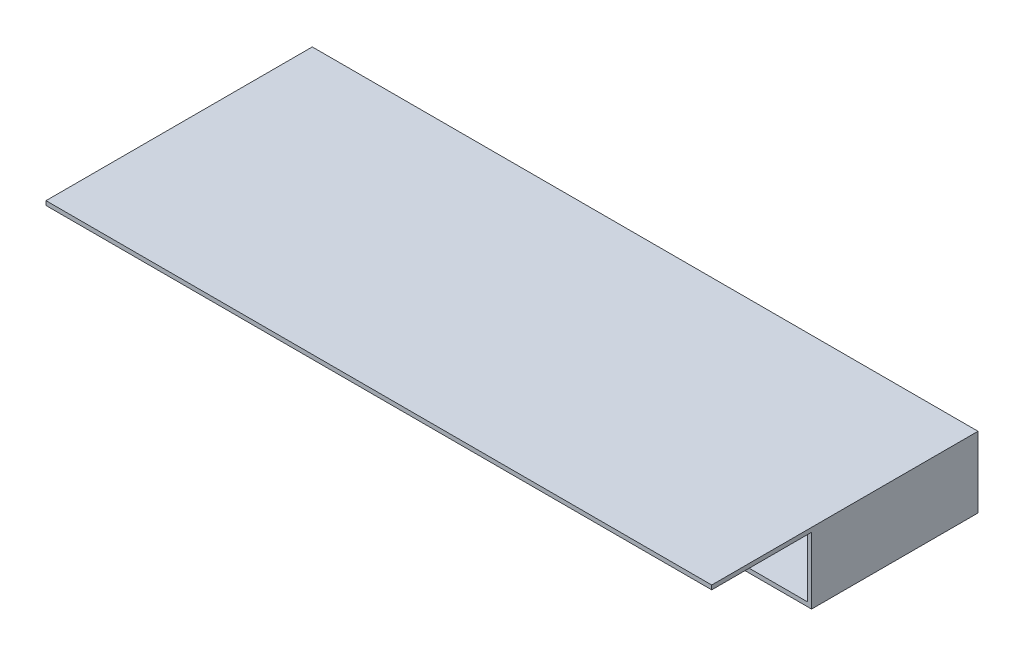
ISO-10303-21;
HEADER;
FILE_DESCRIPTION(('STEP AP214'),'2;1');
FILE_NAME('part.step','',(''),(''),'','','');
FILE_SCHEMA(('AUTOMOTIVE_DESIGN { 1 0 10303 214 1 1 1 1 }'));
ENDSEC;
DATA;
#1=APPLICATION_CONTEXT('core data for automotive mechanical design processes');
#2=APPLICATION_PROTOCOL_DEFINITION('international standard','automotive_design',2000,#1);
#3=PRODUCT_CONTEXT('',#1,'mechanical');
#4=PRODUCT('Part','Part','',(#3));
#5=PRODUCT_RELATED_PRODUCT_CATEGORY('part','',(#4));
#6=PRODUCT_DEFINITION_FORMATION('','',#4);
#7=PRODUCT_DEFINITION_CONTEXT('part definition',#1,'design');
#8=PRODUCT_DEFINITION('design','',#6,#7);
#9=PRODUCT_DEFINITION_SHAPE('','',#8);
#10=(LENGTH_UNIT() NAMED_UNIT(*) SI_UNIT(.MILLI.,.METRE.));
#11=(NAMED_UNIT(*) PLANE_ANGLE_UNIT() SI_UNIT($,.RADIAN.));
#12=(NAMED_UNIT(*) SI_UNIT($,.STERADIAN.) SOLID_ANGLE_UNIT());
#13=UNCERTAINTY_MEASURE_WITH_UNIT(LENGTH_MEASURE(1.E-05),#10,'distance_accuracy_value','');
#14=(GEOMETRIC_REPRESENTATION_CONTEXT(3) GLOBAL_UNCERTAINTY_ASSIGNED_CONTEXT((#13)) GLOBAL_UNIT_ASSIGNED_CONTEXT((#10,
#11,#12)) REPRESENTATION_CONTEXT('',''));
#15=CARTESIAN_POINT('',(0.,0.,0.));
#16=DIRECTION('',(0.,0.,1.));
#17=DIRECTION('',(1.,0.,0.));
#18=AXIS2_PLACEMENT_3D('',#15,#16,#17);
#19=CARTESIAN_POINT('',(0.,0.,0.));
#20=DIRECTION('',(0.,-1.,0.));
#21=DIRECTION('',(0.,0.,-1.));
#22=AXIS2_PLACEMENT_3D('',#19,#20,#21);
#23=PLANE('',#22);
#24=DIRECTION('',(1.,0.,0.));
#25=VECTOR('',#24,1.);
#26=CARTESIAN_POINT('',(12.7,0.,100.));
#27=LINE('',#26,#25);
#28=CARTESIAN_POINT('',(-12.7,0.,100.));
#29=VERTEX_POINT('',#28);
#30=CARTESIAN_POINT('',(12.7,0.,100.));
#31=VERTEX_POINT('',#30);
#32=EDGE_CURVE('E153',#29,#31,#27,.T.);
#33=ORIENTED_EDGE('',*,*,#32,.T.);
#34=DIRECTION('',(0.,0.,-1.));
#35=VECTOR('',#34,1.);
#36=CARTESIAN_POINT('',(12.7,0.,289.014417439517));
#37=LINE('',#36,#35);
#38=CARTESIAN_POINT('',(12.7,0.,-387.3));
#39=VERTEX_POINT('',#38);
#40=EDGE_CURVE('E384',#31,#39,#37,.T.);
#41=ORIENTED_EDGE('',*,*,#40,.T.);
#42=DIRECTION('',(-1.,0.,0.));
#43=VECTOR('',#42,1.);
#44=CARTESIAN_POINT('',(0.,0.,-387.3));
#45=LINE('',#44,#43);
#46=CARTESIAN_POINT('',(987.3,0.,-387.3));
#47=VERTEX_POINT('',#46);
#48=EDGE_CURVE('E170',#47,#39,#45,.T.);
#49=ORIENTED_EDGE('',*,*,#48,.F.);
#50=DIRECTION('',(0.,0.,-1.));
#51=VECTOR('',#50,1.);
#52=CARTESIAN_POINT('',(987.3,0.,0.));
#53=LINE('',#52,#51);
#54=CARTESIAN_POINT('',(987.3,0.,100.));
#55=VERTEX_POINT('',#54);
#56=EDGE_CURVE('E166',#55,#47,#53,.T.);
#57=ORIENTED_EDGE('',*,*,#56,.F.);
#58=DIRECTION('',(-1.,0.,0.));
#59=VECTOR('',#58,1.);
#60=CARTESIAN_POINT('',(-1000.,0.,100.));
#61=LINE('',#60,#59);
#62=CARTESIAN_POINT('',(1000.,0.,100.));
#63=VERTEX_POINT('',#62);
#64=EDGE_CURVE('E189',#63,#55,#61,.T.);
#65=ORIENTED_EDGE('',*,*,#64,.F.);
#66=DIRECTION('',(0.,0.,-1.));
#67=VECTOR('',#66,1.);
#68=CARTESIAN_POINT('',(1000.,0.,400.));
#69=LINE('',#68,#67);
#70=CARTESIAN_POINT('',(1000.,0.,400.));
#71=VERTEX_POINT('',#70);
#72=EDGE_CURVE('E210',#71,#63,#69,.T.);
#73=ORIENTED_EDGE('',*,*,#72,.F.);
#74=DIRECTION('',(-1.,0.,0.));
#75=VECTOR('',#74,1.);
#76=CARTESIAN_POINT('',(1000.,0.,400.));
#77=LINE('',#76,#75);
#78=CARTESIAN_POINT('',(-1000.,0.,400.));
#79=VERTEX_POINT('',#78);
#80=EDGE_CURVE('E205',#71,#79,#77,.T.);
#81=ORIENTED_EDGE('',*,*,#80,.T.);
#82=DIRECTION('',(0.,0.,-1.));
#83=VECTOR('',#82,1.);
#84=CARTESIAN_POINT('',(-1000.,0.,400.));
#85=LINE('',#84,#83);
#86=CARTESIAN_POINT('',(-1000.,0.,100.));
#87=VERTEX_POINT('',#86);
#88=EDGE_CURVE('E219',#79,#87,#85,.T.);
#89=ORIENTED_EDGE('',*,*,#88,.T.);
#90=CARTESIAN_POINT('',(-987.3,0.,100.));
#91=VERTEX_POINT('',#90);
#92=EDGE_CURVE('E199',#91,#87,#61,.T.);
#93=ORIENTED_EDGE('',*,*,#92,.F.);
#94=DIRECTION('',(0.,0.,-1.));
#95=VECTOR('',#94,1.);
#96=CARTESIAN_POINT('',(-987.3,0.,0.));
#97=LINE('',#96,#95);
#98=CARTESIAN_POINT('',(-987.3,0.,-387.3));
#99=VERTEX_POINT('',#98);
#100=EDGE_CURVE('E174',#91,#99,#97,.T.);
#101=ORIENTED_EDGE('',*,*,#100,.T.);
#102=CARTESIAN_POINT('',(-12.7,0.,-387.3));
#103=VERTEX_POINT('',#102);
#104=EDGE_CURVE('E173',#103,#99,#45,.T.);
#105=ORIENTED_EDGE('',*,*,#104,.F.);
#106=DIRECTION('',(0.,0.,-1.));
#107=VECTOR('',#106,1.);
#108=CARTESIAN_POINT('',(-12.7,0.,289.014417439517));
#109=LINE('',#108,#107);
#110=EDGE_CURVE('E139',#29,#103,#109,.T.);
#111=ORIENTED_EDGE('',*,*,#110,.F.);
#112=EDGE_LOOP('',(#33,#41,#49,#57,#65,#73,#81,#89,#93,#101,#105,#111));
#113=FACE_BOUND('',#112,.T.);
#114=ADVANCED_FACE('F33',(#113),#23,.T.);
#115=CARTESIAN_POINT('',(1000.,12.7,-387.3));
#116=DIRECTION('',(0.,0.,1.));
#117=DIRECTION('',(1.,0.,0.));
#118=AXIS2_PLACEMENT_3D('',#115,#116,#117);
#119=PLANE('',#118);
#120=ORIENTED_EDGE('',*,*,#48,.T.);
#121=DIRECTION('',(0.,1.,0.));
#122=VECTOR('',#121,1.);
#123=CARTESIAN_POINT('',(12.7,-187.3,-387.3));
#124=LINE('',#123,#122);
#125=CARTESIAN_POINT('',(12.7,-187.3,-387.3));
#126=VERTEX_POINT('',#125);
#127=EDGE_CURVE('E143',#126,#39,#124,.T.);
#128=ORIENTED_EDGE('',*,*,#127,.F.);
#129=DIRECTION('',(1.,0.,0.));
#130=VECTOR('',#129,1.);
#131=CARTESIAN_POINT('',(0.,-187.3,-387.3));
#132=LINE('',#131,#130);
#133=CARTESIAN_POINT('',(987.3,-187.3,-387.3));
#134=VERTEX_POINT('',#133);
#135=EDGE_CURVE('E160',#126,#134,#132,.T.);
#136=ORIENTED_EDGE('',*,*,#135,.T.);
#137=DIRECTION('',(0.,-1.,0.));
#138=VECTOR('',#137,1.);
#139=CARTESIAN_POINT('',(987.3,12.7,-387.3));
#140=LINE('',#139,#138);
#141=EDGE_CURVE('E169',#47,#134,#140,.T.);
#142=ORIENTED_EDGE('',*,*,#141,.F.);
#143=EDGE_LOOP('',(#120,#128,#136,#142));
#144=FACE_BOUND('',#143,.T.);
#145=ADVANCED_FACE('F267',(#144),#119,.T.);
#146=CARTESIAN_POINT('',(-987.3,-187.3,-387.3));
#147=VERTEX_POINT('',#146);
#148=CARTESIAN_POINT('',(-12.7,-187.3,-387.3));
#149=VERTEX_POINT('',#148);
#150=EDGE_CURVE('E150',#147,#149,#132,.T.);
#151=ORIENTED_EDGE('',*,*,#150,.T.);
#152=DIRECTION('',(0.,-1.,0.));
#153=VECTOR('',#152,1.);
#154=CARTESIAN_POINT('',(-12.7,-187.3,-387.3));
#155=LINE('',#154,#153);
#156=EDGE_CURVE('E136',#103,#149,#155,.T.);
#157=ORIENTED_EDGE('',*,*,#156,.F.);
#158=ORIENTED_EDGE('',*,*,#104,.T.);
#159=DIRECTION('',(0.,-1.,0.));
#160=VECTOR('',#159,1.);
#161=CARTESIAN_POINT('',(-987.3,12.7,-387.3));
#162=LINE('',#161,#160);
#163=EDGE_CURVE('E158',#99,#147,#162,.T.);
#164=ORIENTED_EDGE('',*,*,#163,.T.);
#165=EDGE_LOOP('',(#151,#157,#158,#164));
#166=FACE_BOUND('',#165,.T.);
#167=ADVANCED_FACE('F156',(#166),#119,.T.);
#168=CARTESIAN_POINT('',(0.,-187.3,0.));
#169=DIRECTION('',(0.,1.,0.));
#170=DIRECTION('',(0.,0.,1.));
#171=AXIS2_PLACEMENT_3D('',#168,#169,#170);
#172=PLANE('',#171);
#173=ORIENTED_EDGE('',*,*,#135,.F.);
#174=DIRECTION('',(0.,0.,-1.));
#175=VECTOR('',#174,1.);
#176=CARTESIAN_POINT('',(12.7,-187.3,289.014417439517));
#177=LINE('',#176,#175);
#178=CARTESIAN_POINT('',(12.7,-187.3,100.));
#179=VERTEX_POINT('',#178);
#180=EDGE_CURVE('E154',#179,#126,#177,.T.);
#181=ORIENTED_EDGE('',*,*,#180,.F.);
#182=DIRECTION('',(-1.,0.,0.));
#183=VECTOR('',#182,1.);
#184=CARTESIAN_POINT('',(0.,-187.3,100.));
#185=LINE('',#184,#183);
#186=CARTESIAN_POINT('',(987.3,-187.3,100.));
#187=VERTEX_POINT('',#186);
#188=EDGE_CURVE('E58',#187,#179,#185,.T.);
#189=ORIENTED_EDGE('',*,*,#188,.F.);
#190=DIRECTION('',(0.,0.,1.));
#191=VECTOR('',#190,1.);
#192=CARTESIAN_POINT('',(987.3,-187.3,0.));
#193=LINE('',#192,#191);
#194=EDGE_CURVE('E159',#134,#187,#193,.T.);
#195=ORIENTED_EDGE('',*,*,#194,.F.);
#196=EDGE_LOOP('',(#173,#181,#189,#195));
#197=FACE_BOUND('',#196,.T.);
#198=ADVANCED_FACE('F343',(#197),#172,.T.);
#199=CARTESIAN_POINT('',(-12.7,-187.3,100.));
#200=VERTEX_POINT('',#199);
#201=CARTESIAN_POINT('',(-987.3,-187.3,100.));
#202=VERTEX_POINT('',#201);
#203=EDGE_CURVE('E152',#200,#202,#185,.T.);
#204=ORIENTED_EDGE('',*,*,#203,.F.);
#205=DIRECTION('',(0.,0.,-1.));
#206=VECTOR('',#205,1.);
#207=CARTESIAN_POINT('',(-12.7,-187.3,289.014417439517));
#208=LINE('',#207,#206);
#209=EDGE_CURVE('E50',#200,#149,#208,.T.);
#210=ORIENTED_EDGE('',*,*,#209,.T.);
#211=ORIENTED_EDGE('',*,*,#150,.F.);
#212=DIRECTION('',(0.,0.,-1.));
#213=VECTOR('',#212,1.);
#214=CARTESIAN_POINT('',(-987.3,-187.3,400.));
#215=LINE('',#214,#213);
#216=EDGE_CURVE('E163',#202,#147,#215,.T.);
#217=ORIENTED_EDGE('',*,*,#216,.F.);
#218=EDGE_LOOP('',(#204,#210,#211,#217));
#219=FACE_BOUND('',#218,.T.);
#220=ADVANCED_FACE('F148',(#219),#172,.T.);
#221=CARTESIAN_POINT('',(1000.,12.7,400.));
#222=DIRECTION('',(0.,0.,1.));
#223=DIRECTION('',(1.,0.,0.));
#224=AXIS2_PLACEMENT_3D('',#221,#222,#223);
#225=PLANE('',#224);
#226=ORIENTED_EDGE('',*,*,#80,.F.);
#227=DIRECTION('',(0.,-1.,0.));
#228=VECTOR('',#227,1.);
#229=CARTESIAN_POINT('',(1000.,12.7,400.));
#230=LINE('',#229,#228);
#231=CARTESIAN_POINT('',(1000.,12.7,400.));
#232=VERTEX_POINT('',#231);
#233=EDGE_CURVE('E11',#232,#71,#230,.T.);
#234=ORIENTED_EDGE('',*,*,#233,.F.);
#235=DIRECTION('',(-1.,0.,0.));
#236=VECTOR('',#235,1.);
#237=CARTESIAN_POINT('',(1000.,12.7,400.));
#238=LINE('',#237,#236);
#239=CARTESIAN_POINT('',(-1000.,12.7,400.));
#240=VERTEX_POINT('',#239);
#241=EDGE_CURVE('E206',#232,#240,#238,.T.);
#242=ORIENTED_EDGE('',*,*,#241,.T.);
#243=DIRECTION('',(0.,-1.,0.));
#244=VECTOR('',#243,1.);
#245=CARTESIAN_POINT('',(-1000.,12.7,400.));
#246=LINE('',#245,#244);
#247=EDGE_CURVE('E37',#240,#79,#246,.T.);
#248=ORIENTED_EDGE('',*,*,#247,.T.);
#249=EDGE_LOOP('',(#226,#234,#242,#248));
#250=FACE_BOUND('',#249,.T.);
#251=ADVANCED_FACE('F35',(#250),#225,.T.);
#252=CARTESIAN_POINT('',(1000.,12.7,400.));
#253=DIRECTION('',(-1.,0.,0.));
#254=DIRECTION('',(0.,0.,1.));
#255=AXIS2_PLACEMENT_3D('',#252,#253,#254);
#256=PLANE('',#255);
#257=ORIENTED_EDGE('',*,*,#72,.T.);
#258=DIRECTION('',(0.,1.,0.));
#259=VECTOR('',#258,1.);
#260=CARTESIAN_POINT('',(1000.,-200.,100.));
#261=LINE('',#260,#259);
#262=CARTESIAN_POINT('',(1000.,-200.,100.));
#263=VERTEX_POINT('',#262);
#264=EDGE_CURVE('E202',#263,#63,#261,.T.);
#265=ORIENTED_EDGE('',*,*,#264,.F.);
#266=DIRECTION('',(0.,0.,1.));
#267=VECTOR('',#266,1.);
#268=CARTESIAN_POINT('',(1000.,-200.,-400.));
#269=LINE('',#268,#267);
#270=CARTESIAN_POINT('',(1000.,-200.,-400.));
#271=VERTEX_POINT('',#270);
#272=EDGE_CURVE('E192',#271,#263,#269,.T.);
#273=ORIENTED_EDGE('',*,*,#272,.F.);
#274=DIRECTION('',(0.,-1.,0.));
#275=VECTOR('',#274,1.);
#276=CARTESIAN_POINT('',(1000.,12.7,-400.));
#277=LINE('',#276,#275);
#278=CARTESIAN_POINT('',(1000.,12.7,-400.));
#279=VERTEX_POINT('',#278);
#280=EDGE_CURVE('E42',#279,#271,#277,.T.);
#281=ORIENTED_EDGE('',*,*,#280,.F.);
#282=DIRECTION('',(0.,0.,-1.));
#283=VECTOR('',#282,1.);
#284=CARTESIAN_POINT('',(1000.,12.7,400.));
#285=LINE('',#284,#283);
#286=EDGE_CURVE('E215',#232,#279,#285,.T.);
#287=ORIENTED_EDGE('',*,*,#286,.F.);
#288=ORIENTED_EDGE('',*,*,#233,.T.);
#289=EDGE_LOOP('',(#257,#265,#273,#281,#287,#288));
#290=FACE_BOUND('',#289,.T.);
#291=ADVANCED_FACE('F243',(#290),#256,.F.);
#292=CARTESIAN_POINT('',(1000.,12.7,-400.));
#293=DIRECTION('',(0.,0.,1.));
#294=DIRECTION('',(1.,0.,0.));
#295=AXIS2_PLACEMENT_3D('',#292,#293,#294);
#296=PLANE('',#295);
#297=ORIENTED_EDGE('',*,*,#280,.T.);
#298=DIRECTION('',(1.,0.,0.));
#299=VECTOR('',#298,1.);
#300=CARTESIAN_POINT('',(-1000.,-200.,-400.));
#301=LINE('',#300,#299);
#302=CARTESIAN_POINT('',(-1000.,-200.,-400.));
#303=VERTEX_POINT('',#302);
#304=EDGE_CURVE('E188',#303,#271,#301,.T.);
#305=ORIENTED_EDGE('',*,*,#304,.F.);
#306=DIRECTION('',(0.,-1.,0.));
#307=VECTOR('',#306,1.);
#308=CARTESIAN_POINT('',(-1000.,12.7,-400.));
#309=LINE('',#308,#307);
#310=CARTESIAN_POINT('',(-1000.,12.7,-400.));
#311=VERTEX_POINT('',#310);
#312=EDGE_CURVE('E224',#311,#303,#309,.T.);
#313=ORIENTED_EDGE('',*,*,#312,.F.);
#314=DIRECTION('',(-1.,0.,0.));
#315=VECTOR('',#314,1.);
#316=CARTESIAN_POINT('',(1000.,12.7,-400.));
#317=LINE('',#316,#315);
#318=EDGE_CURVE('E213',#279,#311,#317,.T.);
#319=ORIENTED_EDGE('',*,*,#318,.F.);
#320=EDGE_LOOP('',(#297,#305,#313,#319));
#321=FACE_BOUND('',#320,.T.);
#322=ADVANCED_FACE('F255',(#321),#296,.F.);
#323=CARTESIAN_POINT('',(-1000.,12.7,400.));
#324=DIRECTION('',(-1.,0.,0.));
#325=DIRECTION('',(0.,0.,1.));
#326=AXIS2_PLACEMENT_3D('',#323,#324,#325);
#327=PLANE('',#326);
#328=ORIENTED_EDGE('',*,*,#88,.F.);
#329=ORIENTED_EDGE('',*,*,#247,.F.);
#330=DIRECTION('',(0.,0.,-1.));
#331=VECTOR('',#330,1.);
#332=CARTESIAN_POINT('',(-1000.,12.7,400.));
#333=LINE('',#332,#331);
#334=EDGE_CURVE('E209',#240,#311,#333,.T.);
#335=ORIENTED_EDGE('',*,*,#334,.T.);
#336=ORIENTED_EDGE('',*,*,#312,.T.);
#337=DIRECTION('',(0.,0.,-1.));
#338=VECTOR('',#337,1.);
#339=CARTESIAN_POINT('',(-1000.,-200.,-400.));
#340=LINE('',#339,#338);
#341=CARTESIAN_POINT('',(-1000.,-200.,100.));
#342=VERTEX_POINT('',#341);
#343=EDGE_CURVE('E185',#342,#303,#340,.T.);
#344=ORIENTED_EDGE('',*,*,#343,.F.);
#345=DIRECTION('',(0.,1.,0.));
#346=VECTOR('',#345,1.);
#347=CARTESIAN_POINT('',(-1000.,-200.,100.));
#348=LINE('',#347,#346);
#349=EDGE_CURVE('E196',#342,#87,#348,.T.);
#350=ORIENTED_EDGE('',*,*,#349,.T.);
#351=EDGE_LOOP('',(#328,#329,#335,#336,#344,#350));
#352=FACE_BOUND('',#351,.T.);
#353=ADVANCED_FACE('F234',(#352),#327,.T.);
#354=CARTESIAN_POINT('',(0.,12.7,0.));
#355=DIRECTION('',(0.,-1.,0.));
#356=DIRECTION('',(0.,0.,-1.));
#357=AXIS2_PLACEMENT_3D('',#354,#355,#356);
#358=PLANE('',#357);
#359=ORIENTED_EDGE('',*,*,#241,.F.);
#360=ORIENTED_EDGE('',*,*,#286,.T.);
#361=ORIENTED_EDGE('',*,*,#318,.T.);
#362=ORIENTED_EDGE('',*,*,#334,.F.);
#363=EDGE_LOOP('',(#359,#360,#361,#362));
#364=FACE_BOUND('',#363,.T.);
#365=ADVANCED_FACE('F257',(#364),#358,.F.);
#366=CARTESIAN_POINT('',(-1000.,-200.,100.));
#367=DIRECTION('',(0.,0.,-1.));
#368=DIRECTION('',(-1.,0.,0.));
#369=AXIS2_PLACEMENT_3D('',#366,#367,#368);
#370=PLANE('',#369);
#371=ORIENTED_EDGE('',*,*,#188,.T.);
#372=DIRECTION('',(0.,-1.,0.));
#373=VECTOR('',#372,1.);
#374=CARTESIAN_POINT('',(12.7,-187.3,100.));
#375=LINE('',#374,#373);
#376=EDGE_CURVE('E385',#31,#179,#375,.T.);
#377=ORIENTED_EDGE('',*,*,#376,.F.);
#378=ORIENTED_EDGE('',*,*,#32,.F.);
#379=DIRECTION('',(0.,1.,0.));
#380=VECTOR('',#379,1.);
#381=CARTESIAN_POINT('',(-12.7,-187.3,100.));
#382=LINE('',#381,#380);
#383=EDGE_CURVE('E179',#200,#29,#382,.T.);
#384=ORIENTED_EDGE('',*,*,#383,.F.);
#385=ORIENTED_EDGE('',*,*,#203,.T.);
#386=DIRECTION('',(0.,1.,0.));
#387=VECTOR('',#386,1.);
#388=CARTESIAN_POINT('',(-987.3,-200.,100.));
#389=LINE('',#388,#387);
#390=EDGE_CURVE('E181',#202,#91,#389,.T.);
#391=ORIENTED_EDGE('',*,*,#390,.T.);
#392=ORIENTED_EDGE('',*,*,#92,.T.);
#393=ORIENTED_EDGE('',*,*,#349,.F.);
#394=DIRECTION('',(-1.,0.,0.));
#395=VECTOR('',#394,1.);
#396=CARTESIAN_POINT('',(-1000.,-200.,100.));
#397=LINE('',#396,#395);
#398=EDGE_CURVE('E194',#263,#342,#397,.T.);
#399=ORIENTED_EDGE('',*,*,#398,.F.);
#400=ORIENTED_EDGE('',*,*,#264,.T.);
#401=ORIENTED_EDGE('',*,*,#64,.T.);
#402=DIRECTION('',(0.,1.,0.));
#403=VECTOR('',#402,1.);
#404=CARTESIAN_POINT('',(987.3,-200.,100.));
#405=LINE('',#404,#403);
#406=EDGE_CURVE('E177',#187,#55,#405,.T.);
#407=ORIENTED_EDGE('',*,*,#406,.F.);
#408=EDGE_LOOP('',(#371,#377,#378,#384,#385,#391,#392,#393,#399,#400,#401,#407));
#409=FACE_BOUND('',#408,.T.);
#410=ADVANCED_FACE('F248',(#409),#370,.F.);
#411=CARTESIAN_POINT('',(0.,-200.,0.));
#412=DIRECTION('',(0.,1.,0.));
#413=DIRECTION('',(0.,0.,1.));
#414=AXIS2_PLACEMENT_3D('',#411,#412,#413);
#415=PLANE('',#414);
#416=ORIENTED_EDGE('',*,*,#343,.T.);
#417=ORIENTED_EDGE('',*,*,#304,.T.);
#418=ORIENTED_EDGE('',*,*,#272,.T.);
#419=ORIENTED_EDGE('',*,*,#398,.T.);
#420=EDGE_LOOP('',(#416,#417,#418,#419));
#421=FACE_BOUND('',#420,.T.);
#422=ADVANCED_FACE('F251',(#421),#415,.F.);
#423=CARTESIAN_POINT('',(987.3,12.7,400.));
#424=DIRECTION('',(-1.,0.,0.));
#425=DIRECTION('',(0.,0.,1.));
#426=AXIS2_PLACEMENT_3D('',#423,#424,#425);
#427=PLANE('',#426);
#428=ORIENTED_EDGE('',*,*,#56,.T.);
#429=ORIENTED_EDGE('',*,*,#141,.T.);
#430=ORIENTED_EDGE('',*,*,#194,.T.);
#431=ORIENTED_EDGE('',*,*,#406,.T.);
#432=EDGE_LOOP('',(#428,#429,#430,#431));
#433=FACE_BOUND('',#432,.T.);
#434=ADVANCED_FACE('F297',(#433),#427,.T.);
#435=CARTESIAN_POINT('',(-987.3,12.7,400.));
#436=DIRECTION('',(-1.,0.,0.));
#437=DIRECTION('',(0.,0.,1.));
#438=AXIS2_PLACEMENT_3D('',#435,#436,#437);
#439=PLANE('',#438);
#440=ORIENTED_EDGE('',*,*,#390,.F.);
#441=ORIENTED_EDGE('',*,*,#216,.T.);
#442=ORIENTED_EDGE('',*,*,#163,.F.);
#443=ORIENTED_EDGE('',*,*,#100,.F.);
#444=EDGE_LOOP('',(#440,#441,#442,#443));
#445=FACE_BOUND('',#444,.T.);
#446=ADVANCED_FACE('F307',(#445),#439,.F.);
#447=CARTESIAN_POINT('',(12.7,-187.3,289.014417439517));
#448=DIRECTION('',(-1.,0.,0.));
#449=DIRECTION('',(0.,0.,1.));
#450=AXIS2_PLACEMENT_3D('',#447,#448,#449);
#451=PLANE('',#450);
#452=ORIENTED_EDGE('',*,*,#40,.F.);
#453=ORIENTED_EDGE('',*,*,#376,.T.);
#454=ORIENTED_EDGE('',*,*,#180,.T.);
#455=ORIENTED_EDGE('',*,*,#127,.T.);
#456=EDGE_LOOP('',(#452,#453,#454,#455));
#457=FACE_BOUND('',#456,.T.);
#458=ADVANCED_FACE('F317',(#457),#451,.F.);
#459=CARTESIAN_POINT('',(-12.7,-187.3,289.014417439517));
#460=DIRECTION('',(1.,0.,0.));
#461=DIRECTION('',(0.,0.,-1.));
#462=AXIS2_PLACEMENT_3D('',#459,#460,#461);
#463=PLANE('',#462);
#464=ORIENTED_EDGE('',*,*,#209,.F.);
#465=ORIENTED_EDGE('',*,*,#383,.T.);
#466=ORIENTED_EDGE('',*,*,#110,.T.);
#467=ORIENTED_EDGE('',*,*,#156,.T.);
#468=EDGE_LOOP('',(#464,#465,#466,#467));
#469=FACE_BOUND('',#468,.T.);
#470=ADVANCED_FACE('F137',(#469),#463,.F.);
#471=CLOSED_SHELL('',(#114,#145,#167,#198,#220,#251,#291,#322,#353,#365,#410,#422,#434,#446,
#458,#470));
#472=MANIFOLD_SOLID_BREP('B2',#471);
#473=ADVANCED_BREP_SHAPE_REPRESENTATION('',(#18,#472),#14);
#474=SHAPE_DEFINITION_REPRESENTATION(#9,#473);
ENDSEC;
END-ISO-10303-21;
